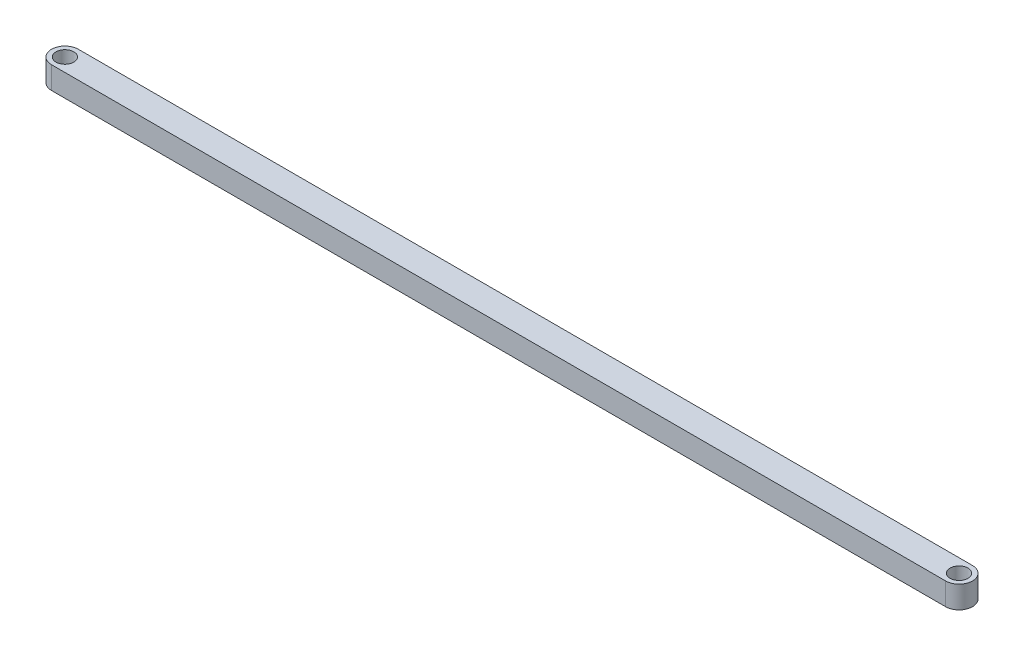
ISO-10303-21;
HEADER;
FILE_DESCRIPTION(('STEP AP214'),'2;1');
FILE_NAME('part.step','',(''),(''),'','','');
FILE_SCHEMA(('AUTOMOTIVE_DESIGN { 1 0 10303 214 1 1 1 1 }'));
ENDSEC;
DATA;
#1=APPLICATION_CONTEXT('core data for automotive mechanical design processes');
#2=APPLICATION_PROTOCOL_DEFINITION('international standard','automotive_design',2000,#1);
#3=PRODUCT_CONTEXT('',#1,'mechanical');
#4=PRODUCT('Part','Part','',(#3));
#5=PRODUCT_RELATED_PRODUCT_CATEGORY('part','',(#4));
#6=PRODUCT_DEFINITION_FORMATION('','',#4);
#7=PRODUCT_DEFINITION_CONTEXT('part definition',#1,'design');
#8=PRODUCT_DEFINITION('design','',#6,#7);
#9=PRODUCT_DEFINITION_SHAPE('','',#8);
#10=(LENGTH_UNIT() NAMED_UNIT(*) SI_UNIT(.MILLI.,.METRE.));
#11=(NAMED_UNIT(*) PLANE_ANGLE_UNIT() SI_UNIT($,.RADIAN.));
#12=(NAMED_UNIT(*) SI_UNIT($,.STERADIAN.) SOLID_ANGLE_UNIT());
#13=UNCERTAINTY_MEASURE_WITH_UNIT(LENGTH_MEASURE(1.E-05),#10,'distance_accuracy_value','');
#14=(GEOMETRIC_REPRESENTATION_CONTEXT(3) GLOBAL_UNCERTAINTY_ASSIGNED_CONTEXT((#13)) GLOBAL_UNIT_ASSIGNED_CONTEXT((#10,
#11,#12)) REPRESENTATION_CONTEXT('',''));
#15=CARTESIAN_POINT('',(0.,0.,0.));
#16=DIRECTION('',(0.,0.,1.));
#17=DIRECTION('',(1.,0.,0.));
#18=AXIS2_PLACEMENT_3D('',#15,#16,#17);
#19=CARTESIAN_POINT('',(49.9999999999999,2.5,0.));
#20=DIRECTION('',(0.,-1.,0.));
#21=DIRECTION('',(0.,0.,-1.));
#22=AXIS2_PLACEMENT_3D('',#19,#20,#21);
#23=CYLINDRICAL_SURFACE('',#22,1.5);
#24=CARTESIAN_POINT('',(49.9999999999999,0.,0.));
#25=DIRECTION('',(0.,1.,0.));
#26=DIRECTION('',(0.,0.,1.));
#27=AXIS2_PLACEMENT_3D('',#24,#25,#26);
#28=CIRCLE('',#27,1.5);
#29=CARTESIAN_POINT('',(49.9999999999999,0.,1.49999999999999));
#30=VERTEX_POINT('',#29);
#31=CARTESIAN_POINT('',(49.9999999999999,0.,-1.50000000000002));
#32=VERTEX_POINT('',#31);
#33=EDGE_CURVE('E108',#30,#32,#28,.T.);
#34=ORIENTED_EDGE('',*,*,#33,.T.);
#35=DIRECTION('',(0.,-1.,0.));
#36=VECTOR('',#35,1.);
#37=CARTESIAN_POINT('',(49.9999999999999,2.5,-1.50000000000002));
#38=LINE('',#37,#36);
#39=CARTESIAN_POINT('',(49.9999999999999,2.5,-1.50000000000002));
#40=VERTEX_POINT('',#39);
#41=EDGE_CURVE('E11',#40,#32,#38,.T.);
#42=ORIENTED_EDGE('',*,*,#41,.F.);
#43=CARTESIAN_POINT('',(49.9999999999999,2.5,0.));
#44=DIRECTION('',(0.,1.,0.));
#45=DIRECTION('',(0.,0.,1.));
#46=AXIS2_PLACEMENT_3D('',#43,#44,#45);
#47=CIRCLE('',#46,1.5);
#48=CARTESIAN_POINT('',(49.9999999999999,2.5,1.49999999999999));
#49=VERTEX_POINT('',#48);
#50=EDGE_CURVE('E79',#49,#40,#47,.T.);
#51=ORIENTED_EDGE('',*,*,#50,.F.);
#52=DIRECTION('',(0.,-1.,0.));
#53=VECTOR('',#52,1.);
#54=CARTESIAN_POINT('',(49.9999999999999,2.5,1.49999999999999));
#55=LINE('',#54,#53);
#56=EDGE_CURVE('E107',#49,#30,#55,.T.);
#57=ORIENTED_EDGE('',*,*,#56,.T.);
#58=EDGE_LOOP('',(#34,#42,#51,#57));
#59=FACE_BOUND('',#58,.T.);
#60=ADVANCED_FACE('F37',(#59),#23,.T.);
#61=CARTESIAN_POINT('',(0.,2.5,-1.50000000000001));
#62=DIRECTION('',(0.,0.,-1.));
#63=DIRECTION('',(-1.,0.,0.));
#64=AXIS2_PLACEMENT_3D('',#61,#62,#63);
#65=PLANE('',#64);
#66=DIRECTION('',(1.,0.,0.));
#67=VECTOR('',#66,1.);
#68=CARTESIAN_POINT('',(0.,0.,-1.50000000000001));
#69=LINE('',#68,#67);
#70=CARTESIAN_POINT('',(-50.0000000000001,0.,-1.5));
#71=VERTEX_POINT('',#70);
#72=EDGE_CURVE('E89',#71,#32,#69,.T.);
#73=ORIENTED_EDGE('',*,*,#72,.F.);
#74=DIRECTION('',(0.,-1.,0.));
#75=VECTOR('',#74,1.);
#76=CARTESIAN_POINT('',(-50.0000000000001,2.5,-1.5));
#77=LINE('',#76,#75);
#78=CARTESIAN_POINT('',(-50.0000000000001,2.5,-1.5));
#79=VERTEX_POINT('',#78);
#80=EDGE_CURVE('E45',#79,#71,#77,.T.);
#81=ORIENTED_EDGE('',*,*,#80,.F.);
#82=DIRECTION('',(1.,0.,0.));
#83=VECTOR('',#82,1.);
#84=CARTESIAN_POINT('',(0.,2.5,-1.50000000000001));
#85=LINE('',#84,#83);
#86=EDGE_CURVE('E87',#79,#40,#85,.T.);
#87=ORIENTED_EDGE('',*,*,#86,.T.);
#88=ORIENTED_EDGE('',*,*,#41,.T.);
#89=EDGE_LOOP('',(#73,#81,#87,#88));
#90=FACE_BOUND('',#89,.T.);
#91=ADVANCED_FACE('F86',(#90),#65,.T.);
#92=CARTESIAN_POINT('',(-50.0000000000001,2.5,0.));
#93=DIRECTION('',(0.,-1.,0.));
#94=DIRECTION('',(0.,0.,-1.));
#95=AXIS2_PLACEMENT_3D('',#92,#93,#94);
#96=CYLINDRICAL_SURFACE('',#95,1.5);
#97=CARTESIAN_POINT('',(-50.0000000000001,0.,0.));
#98=DIRECTION('',(0.,1.,0.));
#99=DIRECTION('',(0.,0.,1.));
#100=AXIS2_PLACEMENT_3D('',#97,#98,#99);
#101=CIRCLE('',#100,1.5);
#102=CARTESIAN_POINT('',(-50.0000000000001,0.,1.49999999999999));
#103=VERTEX_POINT('',#102);
#104=EDGE_CURVE('E68',#71,#103,#101,.T.);
#105=ORIENTED_EDGE('',*,*,#104,.T.);
#106=DIRECTION('',(0.,-1.,0.));
#107=VECTOR('',#106,1.);
#108=CARTESIAN_POINT('',(-50.0000000000001,2.5,1.49999999999999));
#109=LINE('',#108,#107);
#110=CARTESIAN_POINT('',(-50.0000000000001,2.5,1.49999999999999));
#111=VERTEX_POINT('',#110);
#112=EDGE_CURVE('E90',#111,#103,#109,.T.);
#113=ORIENTED_EDGE('',*,*,#112,.F.);
#114=CARTESIAN_POINT('',(-50.0000000000001,2.5,0.));
#115=DIRECTION('',(0.,1.,0.));
#116=DIRECTION('',(0.,0.,1.));
#117=AXIS2_PLACEMENT_3D('',#114,#115,#116);
#118=CIRCLE('',#117,1.5);
#119=EDGE_CURVE('E91',#79,#111,#118,.T.);
#120=ORIENTED_EDGE('',*,*,#119,.F.);
#121=ORIENTED_EDGE('',*,*,#80,.T.);
#122=EDGE_LOOP('',(#105,#113,#120,#121));
#123=FACE_BOUND('',#122,.T.);
#124=ADVANCED_FACE('F92',(#123),#96,.T.);
#125=CARTESIAN_POINT('',(49.9999999999999,2.5,0.));
#126=DIRECTION('',(0.,-1.,0.));
#127=DIRECTION('',(0.,0.,-1.));
#128=AXIS2_PLACEMENT_3D('',#125,#126,#127);
#129=CYLINDRICAL_SURFACE('',#128,0.999999999999998);
#130=CARTESIAN_POINT('',(49.9999999999999,2.5,0.));
#131=DIRECTION('',(0.,1.,0.));
#132=DIRECTION('',(0.,0.,1.));
#133=AXIS2_PLACEMENT_3D('',#130,#131,#132);
#134=CIRCLE('',#133,0.999999999999998);
#135=CARTESIAN_POINT('',(49.9999999999999,2.5,0.999999999999983));
#136=VERTEX_POINT('',#135);
#137=EDGE_CURVE('E101',#136,#136,#134,.T.);
#138=ORIENTED_EDGE('',*,*,#137,.T.);
#139=EDGE_LOOP('',(#138));
#140=FACE_BOUND('',#139,.T.);
#141=CARTESIAN_POINT('',(49.9999999999999,0.,0.));
#142=DIRECTION('',(0.,1.,0.));
#143=DIRECTION('',(0.,0.,1.));
#144=AXIS2_PLACEMENT_3D('',#141,#142,#143);
#145=CIRCLE('',#144,0.999999999999998);
#146=CARTESIAN_POINT('',(49.9999999999999,0.,0.999999999999983));
#147=VERTEX_POINT('',#146);
#148=EDGE_CURVE('E114',#147,#147,#145,.T.);
#149=ORIENTED_EDGE('',*,*,#148,.F.);
#150=EDGE_LOOP('',(#149));
#151=FACE_BOUND('',#150,.T.);
#152=ADVANCED_FACE('F133',(#140,#151),#129,.F.);
#153=CARTESIAN_POINT('',(0.,2.5,1.49999999999999));
#154=DIRECTION('',(0.,0.,-1.));
#155=DIRECTION('',(-1.,0.,0.));
#156=AXIS2_PLACEMENT_3D('',#153,#154,#155);
#157=PLANE('',#156);
#158=DIRECTION('',(1.,0.,0.));
#159=VECTOR('',#158,1.);
#160=CARTESIAN_POINT('',(0.,0.,1.49999999999999));
#161=LINE('',#160,#159);
#162=EDGE_CURVE('E74',#103,#30,#161,.T.);
#163=ORIENTED_EDGE('',*,*,#162,.T.);
#164=ORIENTED_EDGE('',*,*,#56,.F.);
#165=DIRECTION('',(1.,0.,0.));
#166=VECTOR('',#165,1.);
#167=CARTESIAN_POINT('',(0.,2.5,1.49999999999999));
#168=LINE('',#167,#166);
#169=EDGE_CURVE('E53',#111,#49,#168,.T.);
#170=ORIENTED_EDGE('',*,*,#169,.F.);
#171=ORIENTED_EDGE('',*,*,#112,.T.);
#172=EDGE_LOOP('',(#163,#164,#170,#171));
#173=FACE_BOUND('',#172,.T.);
#174=ADVANCED_FACE('F120',(#173),#157,.F.);
#175=CARTESIAN_POINT('',(-50.0000000000001,2.5,0.));
#176=DIRECTION('',(0.,-1.,0.));
#177=DIRECTION('',(0.,0.,-1.));
#178=AXIS2_PLACEMENT_3D('',#175,#176,#177);
#179=CYLINDRICAL_SURFACE('',#178,0.999999999999998);
#180=CARTESIAN_POINT('',(-50.0000000000001,2.5,0.));
#181=DIRECTION('',(0.,1.,0.));
#182=DIRECTION('',(0.,0.,1.));
#183=AXIS2_PLACEMENT_3D('',#180,#181,#182);
#184=CIRCLE('',#183,0.999999999999998);
#185=CARTESIAN_POINT('',(-50.0000000000001,2.5,0.999999999999989));
#186=VERTEX_POINT('',#185);
#187=EDGE_CURVE('E104',#186,#186,#184,.T.);
#188=ORIENTED_EDGE('',*,*,#187,.T.);
#189=EDGE_LOOP('',(#188));
#190=FACE_BOUND('',#189,.T.);
#191=CARTESIAN_POINT('',(-50.0000000000001,0.,0.));
#192=DIRECTION('',(0.,1.,0.));
#193=DIRECTION('',(0.,0.,1.));
#194=AXIS2_PLACEMENT_3D('',#191,#192,#193);
#195=CIRCLE('',#194,0.999999999999998);
#196=CARTESIAN_POINT('',(-50.0000000000001,0.,0.999999999999989));
#197=VERTEX_POINT('',#196);
#198=EDGE_CURVE('E97',#197,#197,#195,.T.);
#199=ORIENTED_EDGE('',*,*,#198,.F.);
#200=EDGE_LOOP('',(#199));
#201=FACE_BOUND('',#200,.T.);
#202=ADVANCED_FACE('F138',(#190,#201),#179,.F.);
#203=CARTESIAN_POINT('',(0.,2.5,0.));
#204=DIRECTION('',(0.,1.,0.));
#205=DIRECTION('',(0.,0.,1.));
#206=AXIS2_PLACEMENT_3D('',#203,#204,#205);
#207=PLANE('',#206);
#208=ORIENTED_EDGE('',*,*,#50,.T.);
#209=ORIENTED_EDGE('',*,*,#86,.F.);
#210=ORIENTED_EDGE('',*,*,#119,.T.);
#211=ORIENTED_EDGE('',*,*,#169,.T.);
#212=EDGE_LOOP('',(#208,#209,#210,#211));
#213=FACE_BOUND('',#212,.T.);
#214=ORIENTED_EDGE('',*,*,#137,.F.);
#215=EDGE_LOOP('',(#214));
#216=FACE_BOUND('',#215,.T.);
#217=ORIENTED_EDGE('',*,*,#187,.F.);
#218=EDGE_LOOP('',(#217));
#219=FACE_BOUND('',#218,.T.);
#220=ADVANCED_FACE('F94',(#213,#216,#219),#207,.T.);
#221=CARTESIAN_POINT('',(0.,0.,0.));
#222=DIRECTION('',(0.,1.,0.));
#223=DIRECTION('',(0.,0.,1.));
#224=AXIS2_PLACEMENT_3D('',#221,#222,#223);
#225=PLANE('',#224);
#226=ORIENTED_EDGE('',*,*,#33,.F.);
#227=ORIENTED_EDGE('',*,*,#162,.F.);
#228=ORIENTED_EDGE('',*,*,#104,.F.);
#229=ORIENTED_EDGE('',*,*,#72,.T.);
#230=EDGE_LOOP('',(#226,#227,#228,#229));
#231=FACE_BOUND('',#230,.T.);
#232=ORIENTED_EDGE('',*,*,#148,.T.);
#233=EDGE_LOOP('',(#232));
#234=FACE_BOUND('',#233,.T.);
#235=ORIENTED_EDGE('',*,*,#198,.T.);
#236=EDGE_LOOP('',(#235));
#237=FACE_BOUND('',#236,.T.);
#238=ADVANCED_FACE('F123',(#231,#234,#237),#225,.F.);
#239=CLOSED_SHELL('',(#60,#91,#124,#152,#174,#202,#220,#238));
#240=MANIFOLD_SOLID_BREP('B2',#239);
#241=ADVANCED_BREP_SHAPE_REPRESENTATION('',(#18,#240),#14);
#242=SHAPE_DEFINITION_REPRESENTATION(#9,#241);
ENDSEC;
END-ISO-10303-21;
